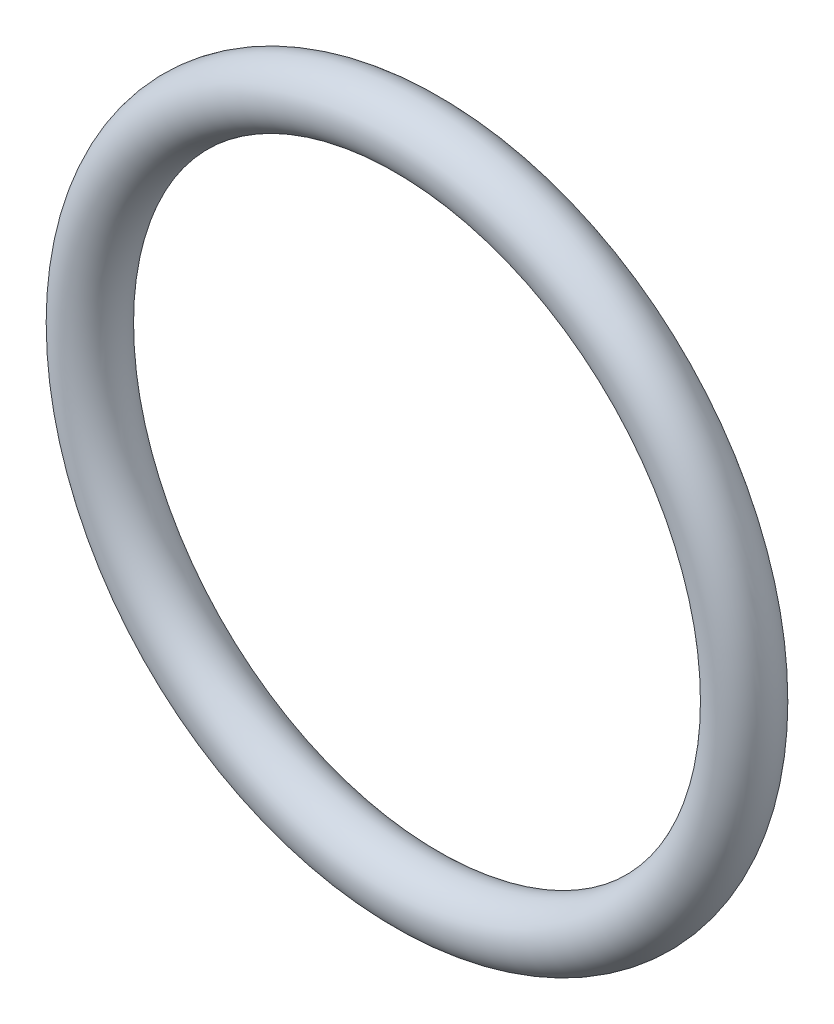
ISO-10303-21;
HEADER;
FILE_DESCRIPTION(('STEP AP214'),'2;1');
FILE_NAME('part.step','',(''),(''),'','','');
FILE_SCHEMA(('AUTOMOTIVE_DESIGN { 1 0 10303 214 1 1 1 1 }'));
ENDSEC;
DATA;
#1=APPLICATION_CONTEXT('core data for automotive mechanical design processes');
#2=APPLICATION_PROTOCOL_DEFINITION('international standard','automotive_design',2000,#1);
#3=PRODUCT_CONTEXT('',#1,'mechanical');
#4=PRODUCT('Part','Part','',(#3));
#5=PRODUCT_RELATED_PRODUCT_CATEGORY('part','',(#4));
#6=PRODUCT_DEFINITION_FORMATION('','',#4);
#7=PRODUCT_DEFINITION_CONTEXT('part definition',#1,'design');
#8=PRODUCT_DEFINITION('design','',#6,#7);
#9=PRODUCT_DEFINITION_SHAPE('','',#8);
#10=(LENGTH_UNIT() NAMED_UNIT(*) SI_UNIT(.MILLI.,.METRE.));
#11=(NAMED_UNIT(*) PLANE_ANGLE_UNIT() SI_UNIT($,.RADIAN.));
#12=(NAMED_UNIT(*) SI_UNIT($,.STERADIAN.) SOLID_ANGLE_UNIT());
#13=UNCERTAINTY_MEASURE_WITH_UNIT(LENGTH_MEASURE(1.E-05),#10,'distance_accuracy_value','');
#14=(GEOMETRIC_REPRESENTATION_CONTEXT(3) GLOBAL_UNCERTAINTY_ASSIGNED_CONTEXT((#13)) GLOBAL_UNIT_ASSIGNED_CONTEXT((#10,
#11,#12)) REPRESENTATION_CONTEXT('',''));
#15=CARTESIAN_POINT('',(0.,0.,0.));
#16=DIRECTION('',(0.,0.,1.));
#17=DIRECTION('',(1.,0.,0.));
#18=AXIS2_PLACEMENT_3D('',#15,#16,#17);
#19=CARTESIAN_POINT('',(0.,0.,0.));
#20=DIRECTION('',(0.,0.,1.));
#21=DIRECTION('',(1.,0.,0.));
#22=AXIS2_PLACEMENT_3D('',#19,#20,#21);
#23=TOROIDAL_SURFACE('',#22,13.843,1.3081);
#24=CARTESIAN_POINT('',(15.1511,0.,0.));
#25=VERTEX_POINT('',#24);
#26=VERTEX_LOOP('',#25);
#27=FACE_BOUND('',#26,.T.);
#28=ADVANCED_FACE('F32',(#27),#23,.T.);
#29=CLOSED_SHELL('',(#28));
#30=MANIFOLD_SOLID_BREP('B2',#29);
#31=ADVANCED_BREP_SHAPE_REPRESENTATION('',(#18,#30),#14);
#32=SHAPE_DEFINITION_REPRESENTATION(#9,#31);
ENDSEC;
END-ISO-10303-21;
